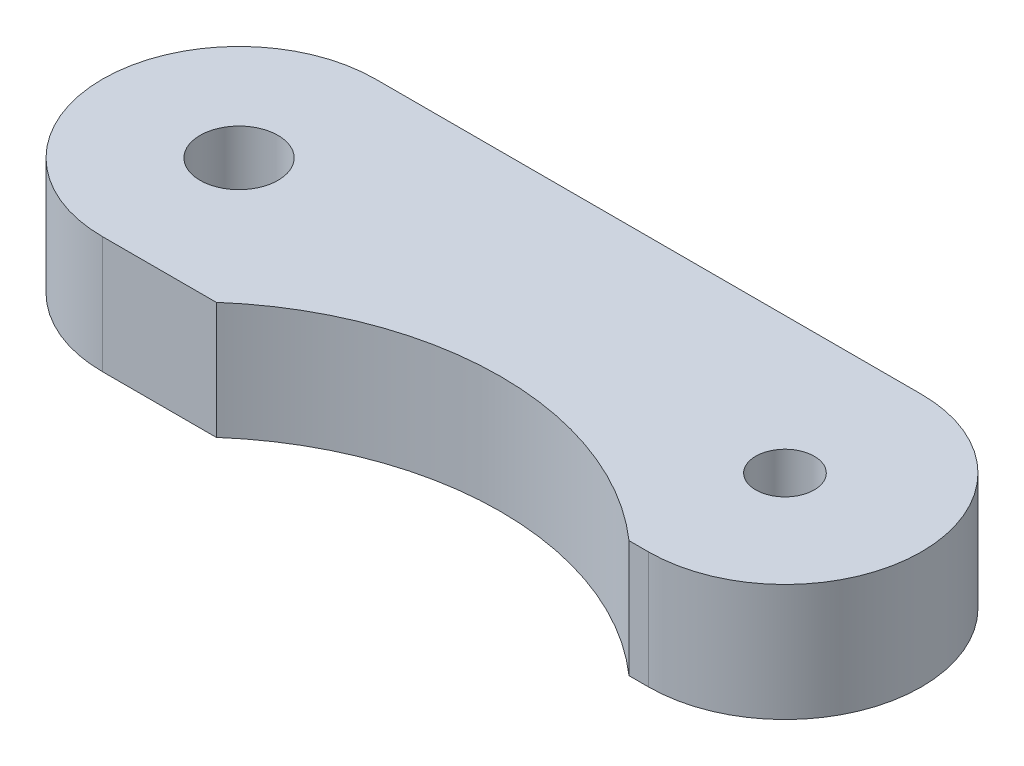
ISO-10303-21;
HEADER;
FILE_DESCRIPTION(('STEP AP214'),'2;1');
FILE_NAME('part.step','',(''),(''),'','','');
FILE_SCHEMA(('AUTOMOTIVE_DESIGN { 1 0 10303 214 1 1 1 1 }'));
ENDSEC;
DATA;
#1=APPLICATION_CONTEXT('core data for automotive mechanical design processes');
#2=APPLICATION_PROTOCOL_DEFINITION('international standard','automotive_design',2000,#1);
#3=PRODUCT_CONTEXT('',#1,'mechanical');
#4=PRODUCT('Part','Part','',(#3));
#5=PRODUCT_RELATED_PRODUCT_CATEGORY('part','',(#4));
#6=PRODUCT_DEFINITION_FORMATION('','',#4);
#7=PRODUCT_DEFINITION_CONTEXT('part definition',#1,'design');
#8=PRODUCT_DEFINITION('design','',#6,#7);
#9=PRODUCT_DEFINITION_SHAPE('','',#8);
#10=(LENGTH_UNIT() NAMED_UNIT(*) SI_UNIT(.MILLI.,.METRE.));
#11=(NAMED_UNIT(*) PLANE_ANGLE_UNIT() SI_UNIT($,.RADIAN.));
#12=(NAMED_UNIT(*) SI_UNIT($,.STERADIAN.) SOLID_ANGLE_UNIT());
#13=UNCERTAINTY_MEASURE_WITH_UNIT(LENGTH_MEASURE(1.E-05),#10,'distance_accuracy_value','');
#14=(GEOMETRIC_REPRESENTATION_CONTEXT(3) GLOBAL_UNCERTAINTY_ASSIGNED_CONTEXT((#13)) GLOBAL_UNIT_ASSIGNED_CONTEXT((#10,
#11,#12)) REPRESENTATION_CONTEXT('',''));
#15=CARTESIAN_POINT('',(0.,0.,0.));
#16=DIRECTION('',(0.,0.,1.));
#17=DIRECTION('',(1.,0.,0.));
#18=AXIS2_PLACEMENT_3D('',#15,#16,#17);
#19=CARTESIAN_POINT('',(0.,3.,3.5));
#20=DIRECTION('',(0.,0.,-1.));
#21=DIRECTION('',(-1.,0.,0.));
#22=AXIS2_PLACEMENT_3D('',#19,#20,#21);
#23=PLANE('',#22);
#24=DIRECTION('',(1.,0.,0.));
#25=VECTOR('',#24,1.);
#26=CARTESIAN_POINT('',(0.,0.,3.5));
#27=LINE('',#26,#25);
#28=CARTESIAN_POINT('',(0.,0.,3.5));
#29=VERTEX_POINT('',#28);
#30=CARTESIAN_POINT('',(2.91699475574164,0.,3.5));
#31=VERTEX_POINT('',#30);
#32=EDGE_CURVE('E100',#29,#31,#27,.T.);
#33=ORIENTED_EDGE('',*,*,#32,.T.);
#34=DIRECTION('',(0.,1.,0.));
#35=VECTOR('',#34,1.);
#36=CARTESIAN_POINT('',(2.91699475574164,-7.,3.5));
#37=LINE('',#36,#35);
#38=CARTESIAN_POINT('',(2.91699475574164,3.,3.5));
#39=VERTEX_POINT('',#38);
#40=EDGE_CURVE('E11',#31,#39,#37,.T.);
#41=ORIENTED_EDGE('',*,*,#40,.T.);
#42=DIRECTION('',(1.,0.,0.));
#43=VECTOR('',#42,1.);
#44=CARTESIAN_POINT('',(0.,3.,3.5));
#45=LINE('',#44,#43);
#46=CARTESIAN_POINT('',(0.,3.,3.5));
#47=VERTEX_POINT('',#46);
#48=EDGE_CURVE('E86',#47,#39,#45,.T.);
#49=ORIENTED_EDGE('',*,*,#48,.F.);
#50=DIRECTION('',(0.,-1.,0.));
#51=VECTOR('',#50,1.);
#52=CARTESIAN_POINT('',(0.,3.,3.5));
#53=LINE('',#52,#51);
#54=EDGE_CURVE('E130',#47,#29,#53,.T.);
#55=ORIENTED_EDGE('',*,*,#54,.T.);
#56=EDGE_LOOP('',(#33,#41,#49,#55));
#57=FACE_BOUND('',#56,.T.);
#58=ADVANCED_FACE('F34',(#57),#23,.F.);
#59=CARTESIAN_POINT('',(0.,3.,0.));
#60=DIRECTION('',(0.,1.,0.));
#61=DIRECTION('',(0.,0.,1.));
#62=AXIS2_PLACEMENT_3D('',#59,#60,#61);
#63=PLANE('',#62);
#64=CARTESIAN_POINT('',(8.20849737787082,3.,9.5));
#65=DIRECTION('',(0.,1.,0.));
#66=DIRECTION('',(0.,0.,-1.));
#67=AXIS2_PLACEMENT_3D('',#64,#65,#66);
#68=CIRCLE('',#67,8.);
#69=CARTESIAN_POINT('',(13.5,3.,3.5));
#70=VERTEX_POINT('',#69);
#71=EDGE_CURVE('E95',#70,#39,#68,.T.);
#72=ORIENTED_EDGE('',*,*,#71,.F.);
#73=CARTESIAN_POINT('',(14.,3.,3.5));
#74=VERTEX_POINT('',#73);
#75=EDGE_CURVE('E107',#70,#74,#45,.T.);
#76=ORIENTED_EDGE('',*,*,#75,.T.);
#77=CARTESIAN_POINT('',(14.,3.,0.));
#78=DIRECTION('',(0.,1.,0.));
#79=DIRECTION('',(0.,0.,1.));
#80=AXIS2_PLACEMENT_3D('',#77,#78,#79);
#81=CIRCLE('',#80,3.5);
#82=CARTESIAN_POINT('',(14.,3.,-3.5));
#83=VERTEX_POINT('',#82);
#84=EDGE_CURVE('E106',#74,#83,#81,.T.);
#85=ORIENTED_EDGE('',*,*,#84,.T.);
#86=DIRECTION('',(-1.,0.,0.));
#87=VECTOR('',#86,1.);
#88=CARTESIAN_POINT('',(0.,3.,-3.5));
#89=LINE('',#88,#87);
#90=CARTESIAN_POINT('',(0.,3.,-3.5));
#91=VERTEX_POINT('',#90);
#92=EDGE_CURVE('E58',#83,#91,#89,.T.);
#93=ORIENTED_EDGE('',*,*,#92,.T.);
#94=CARTESIAN_POINT('',(0.,3.,0.));
#95=DIRECTION('',(0.,1.,0.));
#96=DIRECTION('',(0.,0.,1.));
#97=AXIS2_PLACEMENT_3D('',#94,#95,#96);
#98=CIRCLE('',#97,3.5);
#99=EDGE_CURVE('E104',#91,#47,#98,.T.);
#100=ORIENTED_EDGE('',*,*,#99,.T.);
#101=ORIENTED_EDGE('',*,*,#48,.T.);
#102=EDGE_LOOP('',(#72,#76,#85,#93,#100,#101));
#103=FACE_BOUND('',#102,.T.);
#104=CARTESIAN_POINT('',(14.,3.,0.));
#105=DIRECTION('',(0.,1.,0.));
#106=DIRECTION('',(0.,0.,1.));
#107=AXIS2_PLACEMENT_3D('',#104,#105,#106);
#108=CIRCLE('',#107,0.75);
#109=CARTESIAN_POINT('',(14.,3.,0.75));
#110=VERTEX_POINT('',#109);
#111=EDGE_CURVE('E119',#110,#110,#108,.T.);
#112=ORIENTED_EDGE('',*,*,#111,.F.);
#113=EDGE_LOOP('',(#112));
#114=FACE_BOUND('',#113,.T.);
#115=CARTESIAN_POINT('',(0.,3.,0.));
#116=DIRECTION('',(0.,1.,0.));
#117=DIRECTION('',(0.,0.,1.));
#118=AXIS2_PLACEMENT_3D('',#115,#116,#117);
#119=CIRCLE('',#118,1.);
#120=CARTESIAN_POINT('',(0.,3.,1.));
#121=VERTEX_POINT('',#120);
#122=EDGE_CURVE('E230',#121,#121,#119,.T.);
#123=ORIENTED_EDGE('',*,*,#122,.F.);
#124=EDGE_LOOP('',(#123));
#125=FACE_BOUND('',#124,.T.);
#126=ADVANCED_FACE('F101',(#103,#114,#125),#63,.T.);
#127=CARTESIAN_POINT('',(0.,0.,0.));
#128=DIRECTION('',(0.,1.,0.));
#129=DIRECTION('',(0.,0.,1.));
#130=AXIS2_PLACEMENT_3D('',#127,#128,#129);
#131=PLANE('',#130);
#132=CARTESIAN_POINT('',(13.5,0.,3.5));
#133=VERTEX_POINT('',#132);
#134=CARTESIAN_POINT('',(14.,0.,3.5));
#135=VERTEX_POINT('',#134);
#136=EDGE_CURVE('E118',#133,#135,#27,.T.);
#137=ORIENTED_EDGE('',*,*,#136,.F.);
#138=CARTESIAN_POINT('',(8.20849737787082,0.,9.5));
#139=DIRECTION('',(0.,1.,0.));
#140=DIRECTION('',(0.,0.,1.));
#141=AXIS2_PLACEMENT_3D('',#138,#139,#140);
#142=CIRCLE('',#141,8.);
#143=EDGE_CURVE('E49',#133,#31,#142,.T.);
#144=ORIENTED_EDGE('',*,*,#143,.T.);
#145=ORIENTED_EDGE('',*,*,#32,.F.);
#146=CARTESIAN_POINT('',(0.,0.,0.));
#147=DIRECTION('',(0.,1.,0.));
#148=DIRECTION('',(0.,0.,1.));
#149=AXIS2_PLACEMENT_3D('',#146,#147,#148);
#150=CIRCLE('',#149,3.5);
#151=CARTESIAN_POINT('',(0.,0.,-3.5));
#152=VERTEX_POINT('',#151);
#153=EDGE_CURVE('E115',#152,#29,#150,.T.);
#154=ORIENTED_EDGE('',*,*,#153,.F.);
#155=DIRECTION('',(-1.,0.,0.));
#156=VECTOR('',#155,1.);
#157=CARTESIAN_POINT('',(0.,0.,-3.5));
#158=LINE('',#157,#156);
#159=CARTESIAN_POINT('',(14.,0.,-3.5));
#160=VERTEX_POINT('',#159);
#161=EDGE_CURVE('E79',#160,#152,#158,.T.);
#162=ORIENTED_EDGE('',*,*,#161,.F.);
#163=CARTESIAN_POINT('',(14.,0.,0.));
#164=DIRECTION('',(0.,1.,0.));
#165=DIRECTION('',(0.,0.,1.));
#166=AXIS2_PLACEMENT_3D('',#163,#164,#165);
#167=CIRCLE('',#166,3.5);
#168=EDGE_CURVE('E121',#135,#160,#167,.T.);
#169=ORIENTED_EDGE('',*,*,#168,.F.);
#170=EDGE_LOOP('',(#137,#144,#145,#154,#162,#169));
#171=FACE_BOUND('',#170,.T.);
#172=CARTESIAN_POINT('',(14.,0.,0.));
#173=DIRECTION('',(0.,1.,0.));
#174=DIRECTION('',(0.,0.,1.));
#175=AXIS2_PLACEMENT_3D('',#172,#173,#174);
#176=CIRCLE('',#175,0.75);
#177=CARTESIAN_POINT('',(14.,0.,0.75));
#178=VERTEX_POINT('',#177);
#179=EDGE_CURVE('E236',#178,#178,#176,.T.);
#180=ORIENTED_EDGE('',*,*,#179,.T.);
#181=EDGE_LOOP('',(#180));
#182=FACE_BOUND('',#181,.T.);
#183=CARTESIAN_POINT('',(0.,0.,0.));
#184=DIRECTION('',(0.,1.,0.));
#185=DIRECTION('',(0.,0.,1.));
#186=AXIS2_PLACEMENT_3D('',#183,#184,#185);
#187=CIRCLE('',#186,1.);
#188=CARTESIAN_POINT('',(0.,0.,1.));
#189=VERTEX_POINT('',#188);
#190=EDGE_CURVE('E233',#189,#189,#187,.T.);
#191=ORIENTED_EDGE('',*,*,#190,.T.);
#192=EDGE_LOOP('',(#191));
#193=FACE_BOUND('',#192,.T.);
#194=ADVANCED_FACE('F137',(#171,#182,#193),#131,.F.);
#195=CARTESIAN_POINT('',(0.,3.,0.));
#196=DIRECTION('',(0.,-1.,0.));
#197=DIRECTION('',(0.,0.,-1.));
#198=AXIS2_PLACEMENT_3D('',#195,#196,#197);
#199=CYLINDRICAL_SURFACE('',#198,3.5);
#200=ORIENTED_EDGE('',*,*,#153,.T.);
#201=ORIENTED_EDGE('',*,*,#54,.F.);
#202=ORIENTED_EDGE('',*,*,#99,.F.);
#203=DIRECTION('',(0.,-1.,0.));
#204=VECTOR('',#203,1.);
#205=CARTESIAN_POINT('',(0.,3.,-3.5));
#206=LINE('',#205,#204);
#207=EDGE_CURVE('E114',#91,#152,#206,.T.);
#208=ORIENTED_EDGE('',*,*,#207,.T.);
#209=EDGE_LOOP('',(#200,#201,#202,#208));
#210=FACE_BOUND('',#209,.T.);
#211=ADVANCED_FACE('F36',(#210),#199,.T.);
#212=ORIENTED_EDGE('',*,*,#75,.F.);
#213=DIRECTION('',(0.,1.,0.));
#214=VECTOR('',#213,1.);
#215=CARTESIAN_POINT('',(13.5,-7.,3.5));
#216=LINE('',#215,#214);
#217=EDGE_CURVE('E42',#70,#133,#216,.F.);
#218=ORIENTED_EDGE('',*,*,#217,.T.);
#219=ORIENTED_EDGE('',*,*,#136,.T.);
#220=DIRECTION('',(0.,-1.,0.));
#221=VECTOR('',#220,1.);
#222=CARTESIAN_POINT('',(14.,3.,3.5));
#223=LINE('',#222,#221);
#224=EDGE_CURVE('E127',#74,#135,#223,.T.);
#225=ORIENTED_EDGE('',*,*,#224,.F.);
#226=EDGE_LOOP('',(#212,#218,#219,#225));
#227=FACE_BOUND('',#226,.T.);
#228=ADVANCED_FACE('F133',(#227),#23,.F.);
#229=CARTESIAN_POINT('',(14.,3.,0.));
#230=DIRECTION('',(0.,-1.,0.));
#231=DIRECTION('',(0.,0.,-1.));
#232=AXIS2_PLACEMENT_3D('',#229,#230,#231);
#233=CYLINDRICAL_SURFACE('',#232,3.5);
#234=ORIENTED_EDGE('',*,*,#168,.T.);
#235=DIRECTION('',(0.,-1.,0.));
#236=VECTOR('',#235,1.);
#237=CARTESIAN_POINT('',(14.,3.,-3.5));
#238=LINE('',#237,#236);
#239=EDGE_CURVE('E125',#83,#160,#238,.T.);
#240=ORIENTED_EDGE('',*,*,#239,.F.);
#241=ORIENTED_EDGE('',*,*,#84,.F.);
#242=ORIENTED_EDGE('',*,*,#224,.T.);
#243=EDGE_LOOP('',(#234,#240,#241,#242));
#244=FACE_BOUND('',#243,.T.);
#245=ADVANCED_FACE('F142',(#244),#233,.T.);
#246=CARTESIAN_POINT('',(0.,3.,-3.5));
#247=DIRECTION('',(0.,0.,1.));
#248=DIRECTION('',(1.,0.,0.));
#249=AXIS2_PLACEMENT_3D('',#246,#247,#248);
#250=PLANE('',#249);
#251=ORIENTED_EDGE('',*,*,#161,.T.);
#252=ORIENTED_EDGE('',*,*,#207,.F.);
#253=ORIENTED_EDGE('',*,*,#92,.F.);
#254=ORIENTED_EDGE('',*,*,#239,.T.);
#255=EDGE_LOOP('',(#251,#252,#253,#254));
#256=FACE_BOUND('',#255,.T.);
#257=ADVANCED_FACE('F144',(#256),#250,.F.);
#258=CARTESIAN_POINT('',(14.,3.,0.));
#259=DIRECTION('',(0.,-1.,0.));
#260=DIRECTION('',(0.,0.,-1.));
#261=AXIS2_PLACEMENT_3D('',#258,#259,#260);
#262=CYLINDRICAL_SURFACE('',#261,0.75);
#263=ORIENTED_EDGE('',*,*,#111,.T.);
#264=EDGE_LOOP('',(#263));
#265=FACE_BOUND('',#264,.T.);
#266=ORIENTED_EDGE('',*,*,#179,.F.);
#267=EDGE_LOOP('',(#266));
#268=FACE_BOUND('',#267,.T.);
#269=ADVANCED_FACE('F161',(#265,#268),#262,.F.);
#270=CARTESIAN_POINT('',(0.,3.,0.));
#271=DIRECTION('',(0.,-1.,0.));
#272=DIRECTION('',(0.,0.,-1.));
#273=AXIS2_PLACEMENT_3D('',#270,#271,#272);
#274=CYLINDRICAL_SURFACE('',#273,1.);
#275=ORIENTED_EDGE('',*,*,#122,.T.);
#276=EDGE_LOOP('',(#275));
#277=FACE_BOUND('',#276,.T.);
#278=ORIENTED_EDGE('',*,*,#190,.F.);
#279=EDGE_LOOP('',(#278));
#280=FACE_BOUND('',#279,.T.);
#281=ADVANCED_FACE('F165',(#277,#280),#274,.F.);
#282=CARTESIAN_POINT('',(8.20849737787082,-7.,9.5));
#283=DIRECTION('',(0.,1.,0.));
#284=DIRECTION('',(0.,0.,1.));
#285=AXIS2_PLACEMENT_3D('',#282,#283,#284);
#286=CYLINDRICAL_SURFACE('',#285,8.);
#287=ORIENTED_EDGE('',*,*,#217,.F.);
#288=ORIENTED_EDGE('',*,*,#71,.T.);
#289=ORIENTED_EDGE('',*,*,#40,.F.);
#290=ORIENTED_EDGE('',*,*,#143,.F.);
#291=EDGE_LOOP('',(#287,#288,#289,#290));
#292=FACE_BOUND('',#291,.T.);
#293=ADVANCED_FACE('F96',(#292),#286,.F.);
#294=CLOSED_SHELL('',(#58,#126,#194,#211,#228,#245,#257,#269,#281,#293));
#295=MANIFOLD_SOLID_BREP('B2',#294);
#296=ADVANCED_BREP_SHAPE_REPRESENTATION('',(#18,#295),#14);
#297=SHAPE_DEFINITION_REPRESENTATION(#9,#296);
ENDSEC;
END-ISO-10303-21;
